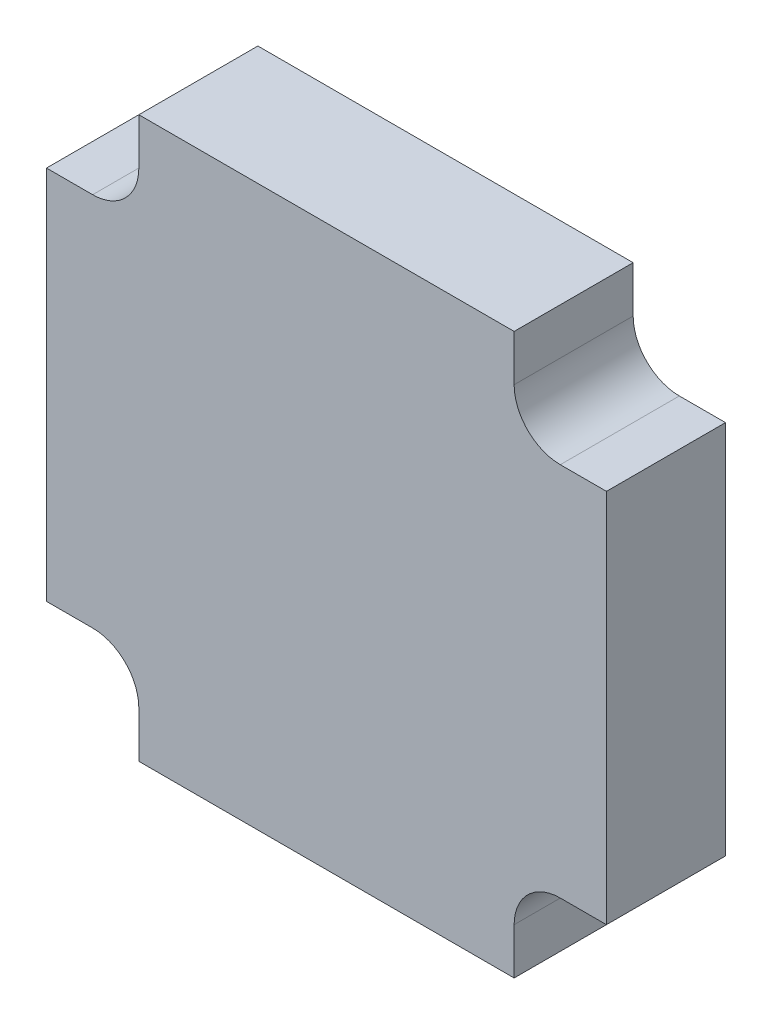
ISO-10303-21;
HEADER;
FILE_DESCRIPTION(('STEP AP214'),'2;1');
FILE_NAME('part.step','',(''),(''),'','','');
FILE_SCHEMA(('AUTOMOTIVE_DESIGN { 1 0 10303 214 1 1 1 1 }'));
ENDSEC;
DATA;
#1=APPLICATION_CONTEXT('core data for automotive mechanical design processes');
#2=APPLICATION_PROTOCOL_DEFINITION('international standard','automotive_design',2000,#1);
#3=PRODUCT_CONTEXT('',#1,'mechanical');
#4=PRODUCT('Part','Part','',(#3));
#5=PRODUCT_RELATED_PRODUCT_CATEGORY('part','',(#4));
#6=PRODUCT_DEFINITION_FORMATION('','',#4);
#7=PRODUCT_DEFINITION_CONTEXT('part definition',#1,'design');
#8=PRODUCT_DEFINITION('design','',#6,#7);
#9=PRODUCT_DEFINITION_SHAPE('','',#8);
#10=(LENGTH_UNIT() NAMED_UNIT(*) SI_UNIT(.MILLI.,.METRE.));
#11=(NAMED_UNIT(*) PLANE_ANGLE_UNIT() SI_UNIT($,.RADIAN.));
#12=(NAMED_UNIT(*) SI_UNIT($,.STERADIAN.) SOLID_ANGLE_UNIT());
#13=UNCERTAINTY_MEASURE_WITH_UNIT(LENGTH_MEASURE(1.E-05),#10,'distance_accuracy_value','');
#14=(GEOMETRIC_REPRESENTATION_CONTEXT(3) GLOBAL_UNCERTAINTY_ASSIGNED_CONTEXT((#13)) GLOBAL_UNIT_ASSIGNED_CONTEXT((#10,
#11,#12)) REPRESENTATION_CONTEXT('',''));
#15=CARTESIAN_POINT('',(0.,0.,0.));
#16=DIRECTION('',(0.,0.,1.));
#17=DIRECTION('',(1.,0.,0.));
#18=AXIS2_PLACEMENT_3D('',#15,#16,#17);
#19=CARTESIAN_POINT('',(0.,0.,-51.));
#20=DIRECTION('',(0.,0.,-1.));
#21=DIRECTION('',(-1.,0.,0.));
#22=AXIS2_PLACEMENT_3D('',#19,#20,#21);
#23=PLANE('',#22);
#24=CARTESIAN_POINT('',(0.,0.,-51.));
#25=DIRECTION('',(0.,0.,-1.));
#26=DIRECTION('',(-1.,0.,0.));
#27=AXIS2_PLACEMENT_3D('',#24,#25,#26);
#28=CIRCLE('',#27,6.);
#29=CARTESIAN_POINT('',(-6.,0.,-51.));
#30=VERTEX_POINT('',#29);
#31=EDGE_CURVE('E20',#30,#30,#28,.T.);
#32=ORIENTED_EDGE('',*,*,#31,.T.);
#33=EDGE_LOOP('',(#32));
#34=FACE_BOUND('',#33,.T.);
#35=ADVANCED_FACE('F17',(#34),#23,.T.);
#36=CARTESIAN_POINT('',(0.,0.,-51.));
#37=DIRECTION('',(0.,0.,-1.));
#38=DIRECTION('',(-1.,0.,0.));
#39=AXIS2_PLACEMENT_3D('',#36,#37,#38);
#40=CYLINDRICAL_SURFACE('',#39,6.);
#41=CARTESIAN_POINT('',(0.,0.,-54.));
#42=DIRECTION('',(0.,0.,-1.));
#43=DIRECTION('',(-1.,0.,0.));
#44=AXIS2_PLACEMENT_3D('',#41,#42,#43);
#45=CIRCLE('',#44,6.);
#46=CARTESIAN_POINT('',(-6.,0.,-54.));
#47=VERTEX_POINT('',#46);
#48=EDGE_CURVE('E230',#47,#47,#45,.F.);
#49=ORIENTED_EDGE('',*,*,#48,.F.);
#50=EDGE_LOOP('',(#49));
#51=FACE_BOUND('',#50,.T.);
#52=ORIENTED_EDGE('',*,*,#31,.F.);
#53=EDGE_LOOP('',(#52));
#54=FACE_BOUND('',#53,.T.);
#55=ADVANCED_FACE('F219',(#51,#54),#40,.F.);
#56=CARTESIAN_POINT('',(28.2,28.2,-54.));
#57=DIRECTION('',(0.,0.,-1.));
#58=DIRECTION('',(-1.,0.,0.));
#59=AXIS2_PLACEMENT_3D('',#56,#57,#58);
#60=PLANE('',#59);
#61=ORIENTED_EDGE('',*,*,#48,.T.);
#62=EDGE_LOOP('',(#61));
#63=FACE_BOUND('',#62,.T.);
#64=CARTESIAN_POINT('',(-23.55,-23.55,-54.));
#65=DIRECTION('',(0.,0.,-1.));
#66=DIRECTION('',(-1.,0.,0.));
#67=AXIS2_PLACEMENT_3D('',#64,#65,#66);
#68=CIRCLE('',#67,4.65);
#69=CARTESIAN_POINT('',(-18.9,-23.55,-54.));
#70=VERTEX_POINT('',#69);
#71=CARTESIAN_POINT('',(-23.55,-18.9,-54.));
#72=VERTEX_POINT('',#71);
#73=EDGE_CURVE('E248',#70,#72,#68,.F.);
#74=ORIENTED_EDGE('',*,*,#73,.T.);
#75=DIRECTION('',(1.,0.,0.));
#76=VECTOR('',#75,1.);
#77=CARTESIAN_POINT('',(-23.55,-18.9,-54.));
#78=LINE('',#77,#76);
#79=CARTESIAN_POINT('',(-28.2,-18.9,-54.));
#80=VERTEX_POINT('',#79);
#81=EDGE_CURVE('E148',#72,#80,#78,.F.);
#82=ORIENTED_EDGE('',*,*,#81,.T.);
#83=DIRECTION('',(0.,1.,0.));
#84=VECTOR('',#83,1.);
#85=CARTESIAN_POINT('',(-28.2,-28.2,-54.));
#86=LINE('',#85,#84);
#87=CARTESIAN_POINT('',(-28.2,18.9,-54.));
#88=VERTEX_POINT('',#87);
#89=EDGE_CURVE('E100',#88,#80,#86,.F.);
#90=ORIENTED_EDGE('',*,*,#89,.F.);
#91=DIRECTION('',(1.,0.,0.));
#92=VECTOR('',#91,1.);
#93=CARTESIAN_POINT('',(-23.55,18.9,-54.));
#94=LINE('',#93,#92);
#95=CARTESIAN_POINT('',(-23.55,18.9,-54.));
#96=VERTEX_POINT('',#95);
#97=EDGE_CURVE('E95',#88,#96,#94,.T.);
#98=ORIENTED_EDGE('',*,*,#97,.T.);
#99=CARTESIAN_POINT('',(-23.55,23.55,-54.));
#100=DIRECTION('',(0.,0.,-1.));
#101=DIRECTION('',(-1.,0.,0.));
#102=AXIS2_PLACEMENT_3D('',#99,#100,#101);
#103=CIRCLE('',#102,4.65);
#104=CARTESIAN_POINT('',(-18.9,23.55,-54.));
#105=VERTEX_POINT('',#104);
#106=EDGE_CURVE('E236',#96,#105,#103,.F.);
#107=ORIENTED_EDGE('',*,*,#106,.T.);
#108=DIRECTION('',(0.,1.,0.));
#109=VECTOR('',#108,1.);
#110=CARTESIAN_POINT('',(-18.9,23.55,-54.));
#111=LINE('',#110,#109);
#112=CARTESIAN_POINT('',(-18.9,28.2,-54.));
#113=VERTEX_POINT('',#112);
#114=EDGE_CURVE('E272',#105,#113,#111,.T.);
#115=ORIENTED_EDGE('',*,*,#114,.T.);
#116=DIRECTION('',(1.,0.,0.));
#117=VECTOR('',#116,1.);
#118=CARTESIAN_POINT('',(-28.2,28.2,-54.));
#119=LINE('',#118,#117);
#120=CARTESIAN_POINT('',(18.9,28.2,-54.));
#121=VERTEX_POINT('',#120);
#122=EDGE_CURVE('E275',#121,#113,#119,.F.);
#123=ORIENTED_EDGE('',*,*,#122,.F.);
#124=DIRECTION('',(0.,1.,0.));
#125=VECTOR('',#124,1.);
#126=CARTESIAN_POINT('',(18.9,23.55,-54.));
#127=LINE('',#126,#125);
#128=CARTESIAN_POINT('',(18.9,23.55,-54.));
#129=VERTEX_POINT('',#128);
#130=EDGE_CURVE('E282',#121,#129,#127,.F.);
#131=ORIENTED_EDGE('',*,*,#130,.T.);
#132=CARTESIAN_POINT('',(23.55,23.55,-54.));
#133=DIRECTION('',(0.,0.,-1.));
#134=DIRECTION('',(-1.,0.,0.));
#135=AXIS2_PLACEMENT_3D('',#132,#133,#134);
#136=CIRCLE('',#135,4.65);
#137=CARTESIAN_POINT('',(23.55,18.9,-54.));
#138=VERTEX_POINT('',#137);
#139=EDGE_CURVE('E240',#129,#138,#136,.F.);
#140=ORIENTED_EDGE('',*,*,#139,.T.);
#141=DIRECTION('',(1.,0.,0.));
#142=VECTOR('',#141,1.);
#143=CARTESIAN_POINT('',(23.55,18.9,-54.));
#144=LINE('',#143,#142);
#145=CARTESIAN_POINT('',(28.2,18.9,-54.));
#146=VERTEX_POINT('',#145);
#147=EDGE_CURVE('E287',#138,#146,#144,.T.);
#148=ORIENTED_EDGE('',*,*,#147,.T.);
#149=DIRECTION('',(0.,1.,0.));
#150=VECTOR('',#149,1.);
#151=CARTESIAN_POINT('',(28.2,-28.2,-54.));
#152=LINE('',#151,#150);
#153=CARTESIAN_POINT('',(28.2,-18.9,-54.));
#154=VERTEX_POINT('',#153);
#155=EDGE_CURVE('E290',#154,#146,#152,.T.);
#156=ORIENTED_EDGE('',*,*,#155,.F.);
#157=DIRECTION('',(1.,0.,0.));
#158=VECTOR('',#157,1.);
#159=CARTESIAN_POINT('',(23.55,-18.9,-54.));
#160=LINE('',#159,#158);
#161=CARTESIAN_POINT('',(23.55,-18.9,-54.));
#162=VERTEX_POINT('',#161);
#163=EDGE_CURVE('E297',#154,#162,#160,.F.);
#164=ORIENTED_EDGE('',*,*,#163,.T.);
#165=CARTESIAN_POINT('',(23.55,-23.55,-54.));
#166=DIRECTION('',(0.,0.,-1.));
#167=DIRECTION('',(-1.,0.,0.));
#168=AXIS2_PLACEMENT_3D('',#165,#166,#167);
#169=CIRCLE('',#168,4.65);
#170=CARTESIAN_POINT('',(18.9,-23.55,-54.));
#171=VERTEX_POINT('',#170);
#172=EDGE_CURVE('E244',#162,#171,#169,.F.);
#173=ORIENTED_EDGE('',*,*,#172,.T.);
#174=DIRECTION('',(0.,1.,0.));
#175=VECTOR('',#174,1.);
#176=CARTESIAN_POINT('',(18.9,-23.55,-54.));
#177=LINE('',#176,#175);
#178=CARTESIAN_POINT('',(18.9,-28.2,-54.));
#179=VERTEX_POINT('',#178);
#180=EDGE_CURVE('E302',#171,#179,#177,.F.);
#181=ORIENTED_EDGE('',*,*,#180,.T.);
#182=DIRECTION('',(1.,0.,0.));
#183=VECTOR('',#182,1.);
#184=CARTESIAN_POINT('',(-28.2,-28.2,-54.));
#185=LINE('',#184,#183);
#186=CARTESIAN_POINT('',(-18.9,-28.2,-54.));
#187=VERTEX_POINT('',#186);
#188=EDGE_CURVE('E305',#187,#179,#185,.T.);
#189=ORIENTED_EDGE('',*,*,#188,.F.);
#190=DIRECTION('',(0.,1.,0.));
#191=VECTOR('',#190,1.);
#192=CARTESIAN_POINT('',(-18.9,-23.55,-54.));
#193=LINE('',#192,#191);
#194=EDGE_CURVE('E312',#187,#70,#193,.T.);
#195=ORIENTED_EDGE('',*,*,#194,.T.);
#196=EDGE_LOOP('',(#74,#82,#90,#98,#107,#115,#123,#131,#140,#148,#156,#164,#173,#181,#189,#195));
#197=FACE_BOUND('',#196,.T.);
#198=ADVANCED_FACE('F217',(#63,#197),#60,.T.);
#199=CARTESIAN_POINT('',(-28.2,-28.2,-54.));
#200=DIRECTION('',(-1.,0.,0.));
#201=DIRECTION('',(0.,0.,1.));
#202=AXIS2_PLACEMENT_3D('',#199,#200,#201);
#203=PLANE('',#202);
#204=DIRECTION('',(0.,0.,1.));
#205=VECTOR('',#204,1.);
#206=CARTESIAN_POINT('',(-28.2,-18.9,-4.8));
#207=LINE('',#206,#205);
#208=CARTESIAN_POINT('',(-28.2,-18.9,-42.01));
#209=VERTEX_POINT('',#208);
#210=EDGE_CURVE('E144',#80,#209,#207,.T.);
#211=ORIENTED_EDGE('',*,*,#210,.T.);
#212=DIRECTION('',(0.,1.,0.));
#213=VECTOR('',#212,1.);
#214=CARTESIAN_POINT('',(-28.2,-28.21,-42.01));
#215=LINE('',#214,#213);
#216=CARTESIAN_POINT('',(-28.2,18.9,-42.01));
#217=VERTEX_POINT('',#216);
#218=EDGE_CURVE('E134',#209,#217,#215,.T.);
#219=ORIENTED_EDGE('',*,*,#218,.T.);
#220=DIRECTION('',(0.,0.,-1.));
#221=VECTOR('',#220,1.);
#222=CARTESIAN_POINT('',(-28.2,18.9,-4.8));
#223=LINE('',#222,#221);
#224=EDGE_CURVE('E233',#217,#88,#223,.T.);
#225=ORIENTED_EDGE('',*,*,#224,.T.);
#226=ORIENTED_EDGE('',*,*,#89,.T.);
#227=EDGE_LOOP('',(#211,#219,#225,#226));
#228=FACE_BOUND('',#227,.T.);
#229=ADVANCED_FACE('F147',(#228),#203,.T.);
#230=CARTESIAN_POINT('',(-23.55,18.9,-4.8));
#231=DIRECTION('',(0.,-1.,0.));
#232=DIRECTION('',(0.,0.,-1.));
#233=AXIS2_PLACEMENT_3D('',#230,#231,#232);
#234=PLANE('',#233);
#235=DIRECTION('',(0.,0.,-1.));
#236=VECTOR('',#235,1.);
#237=CARTESIAN_POINT('',(-23.55,18.9,-4.8));
#238=LINE('',#237,#236);
#239=CARTESIAN_POINT('',(-23.55,18.9,-42.01));
#240=VERTEX_POINT('',#239);
#241=EDGE_CURVE('E239',#240,#96,#238,.T.);
#242=ORIENTED_EDGE('',*,*,#241,.T.);
#243=ORIENTED_EDGE('',*,*,#97,.F.);
#244=ORIENTED_EDGE('',*,*,#224,.F.);
#245=DIRECTION('',(-1.,0.,0.));
#246=VECTOR('',#245,1.);
#247=CARTESIAN_POINT('',(28.2,18.9,-42.01));
#248=LINE('',#247,#246);
#249=EDGE_CURVE('E141',#217,#240,#248,.F.);
#250=ORIENTED_EDGE('',*,*,#249,.T.);
#251=EDGE_LOOP('',(#242,#243,#244,#250));
#252=FACE_BOUND('',#251,.T.);
#253=ADVANCED_FACE('F210',(#252),#234,.F.);
#254=CARTESIAN_POINT('',(-23.55,23.55,-4.8));
#255=DIRECTION('',(0.,0.,-1.));
#256=DIRECTION('',(-1.,0.,0.));
#257=AXIS2_PLACEMENT_3D('',#254,#255,#256);
#258=CYLINDRICAL_SURFACE('',#257,4.65);
#259=DIRECTION('',(0.,0.,-1.));
#260=VECTOR('',#259,1.);
#261=CARTESIAN_POINT('',(-18.9,23.55,-4.8));
#262=LINE('',#261,#260);
#263=CARTESIAN_POINT('',(-18.9,23.55,-42.01));
#264=VERTEX_POINT('',#263);
#265=EDGE_CURVE('E238',#264,#105,#262,.T.);
#266=ORIENTED_EDGE('',*,*,#265,.T.);
#267=ORIENTED_EDGE('',*,*,#106,.F.);
#268=ORIENTED_EDGE('',*,*,#241,.F.);
#269=CARTESIAN_POINT('',(-23.55,23.55,-42.01));
#270=DIRECTION('',(0.,0.,-1.));
#271=DIRECTION('',(-1.,0.,0.));
#272=AXIS2_PLACEMENT_3D('',#269,#270,#271);
#273=CIRCLE('',#272,4.65);
#274=EDGE_CURVE('E251',#240,#264,#273,.F.);
#275=ORIENTED_EDGE('',*,*,#274,.T.);
#276=EDGE_LOOP('',(#266,#267,#268,#275));
#277=FACE_BOUND('',#276,.T.);
#278=ADVANCED_FACE('F206',(#277),#258,.F.);
#279=CARTESIAN_POINT('',(-18.9,23.55,-4.8));
#280=DIRECTION('',(1.,0.,0.));
#281=DIRECTION('',(0.,0.,-1.));
#282=AXIS2_PLACEMENT_3D('',#279,#280,#281);
#283=PLANE('',#282);
#284=DIRECTION('',(0.,0.,1.));
#285=VECTOR('',#284,1.);
#286=CARTESIAN_POINT('',(-18.9,28.2,-54.));
#287=LINE('',#286,#285);
#288=CARTESIAN_POINT('',(-18.9,28.2,-42.01));
#289=VERTEX_POINT('',#288);
#290=EDGE_CURVE('E279',#113,#289,#287,.T.);
#291=ORIENTED_EDGE('',*,*,#290,.F.);
#292=ORIENTED_EDGE('',*,*,#114,.F.);
#293=ORIENTED_EDGE('',*,*,#265,.F.);
#294=DIRECTION('',(0.,1.,0.));
#295=VECTOR('',#294,1.);
#296=CARTESIAN_POINT('',(-18.9,-28.21,-42.01));
#297=LINE('',#296,#295);
#298=EDGE_CURVE('E254',#264,#289,#297,.T.);
#299=ORIENTED_EDGE('',*,*,#298,.T.);
#300=EDGE_LOOP('',(#291,#292,#293,#299));
#301=FACE_BOUND('',#300,.T.);
#302=ADVANCED_FACE('F202',(#301),#283,.F.);
#303=CARTESIAN_POINT('',(-28.2,28.2,-54.));
#304=DIRECTION('',(0.,1.,0.));
#305=DIRECTION('',(0.,0.,1.));
#306=AXIS2_PLACEMENT_3D('',#303,#304,#305);
#307=PLANE('',#306);
#308=ORIENTED_EDGE('',*,*,#290,.T.);
#309=DIRECTION('',(-1.,0.,0.));
#310=VECTOR('',#309,1.);
#311=CARTESIAN_POINT('',(28.2,28.2,-42.01));
#312=LINE('',#311,#310);
#313=CARTESIAN_POINT('',(18.9,28.2,-42.01));
#314=VERTEX_POINT('',#313);
#315=EDGE_CURVE('E332',#289,#314,#312,.F.);
#316=ORIENTED_EDGE('',*,*,#315,.T.);
#317=DIRECTION('',(0.,0.,1.));
#318=VECTOR('',#317,1.);
#319=CARTESIAN_POINT('',(18.9,28.2,-4.8));
#320=LINE('',#319,#318);
#321=EDGE_CURVE('E284',#314,#121,#320,.F.);
#322=ORIENTED_EDGE('',*,*,#321,.T.);
#323=ORIENTED_EDGE('',*,*,#122,.T.);
#324=EDGE_LOOP('',(#308,#316,#322,#323));
#325=FACE_BOUND('',#324,.T.);
#326=ADVANCED_FACE('F198',(#325),#307,.T.);
#327=CARTESIAN_POINT('',(18.9,23.55,-4.8));
#328=DIRECTION('',(-1.,0.,0.));
#329=DIRECTION('',(0.,0.,1.));
#330=AXIS2_PLACEMENT_3D('',#327,#328,#329);
#331=PLANE('',#330);
#332=DIRECTION('',(0.,0.,-1.));
#333=VECTOR('',#332,1.);
#334=CARTESIAN_POINT('',(18.9,23.55,-4.8));
#335=LINE('',#334,#333);
#336=CARTESIAN_POINT('',(18.9,23.55,-42.01));
#337=VERTEX_POINT('',#336);
#338=EDGE_CURVE('E243',#337,#129,#335,.T.);
#339=ORIENTED_EDGE('',*,*,#338,.T.);
#340=ORIENTED_EDGE('',*,*,#130,.F.);
#341=ORIENTED_EDGE('',*,*,#321,.F.);
#342=DIRECTION('',(0.,1.,0.));
#343=VECTOR('',#342,1.);
#344=CARTESIAN_POINT('',(18.9,-28.21,-42.01));
#345=LINE('',#344,#343);
#346=EDGE_CURVE('E259',#314,#337,#345,.F.);
#347=ORIENTED_EDGE('',*,*,#346,.T.);
#348=EDGE_LOOP('',(#339,#340,#341,#347));
#349=FACE_BOUND('',#348,.T.);
#350=ADVANCED_FACE('F194',(#349),#331,.F.);
#351=CARTESIAN_POINT('',(23.55,23.55,-4.8));
#352=DIRECTION('',(0.,0.,-1.));
#353=DIRECTION('',(-1.,0.,0.));
#354=AXIS2_PLACEMENT_3D('',#351,#352,#353);
#355=CYLINDRICAL_SURFACE('',#354,4.65);
#356=DIRECTION('',(0.,0.,-1.));
#357=VECTOR('',#356,1.);
#358=CARTESIAN_POINT('',(23.55,18.9,-4.8));
#359=LINE('',#358,#357);
#360=CARTESIAN_POINT('',(23.55,18.9,-42.01));
#361=VERTEX_POINT('',#360);
#362=EDGE_CURVE('E242',#361,#138,#359,.T.);
#363=ORIENTED_EDGE('',*,*,#362,.T.);
#364=ORIENTED_EDGE('',*,*,#139,.F.);
#365=ORIENTED_EDGE('',*,*,#338,.F.);
#366=CARTESIAN_POINT('',(23.55,23.55,-42.01));
#367=DIRECTION('',(0.,0.,-1.));
#368=DIRECTION('',(-1.,0.,0.));
#369=AXIS2_PLACEMENT_3D('',#366,#367,#368);
#370=CIRCLE('',#369,4.65);
#371=EDGE_CURVE('E255',#337,#361,#370,.F.);
#372=ORIENTED_EDGE('',*,*,#371,.T.);
#373=EDGE_LOOP('',(#363,#364,#365,#372));
#374=FACE_BOUND('',#373,.T.);
#375=ADVANCED_FACE('F190',(#374),#355,.F.);
#376=CARTESIAN_POINT('',(23.55,18.9,-4.8));
#377=DIRECTION('',(0.,-1.,0.));
#378=DIRECTION('',(0.,0.,-1.));
#379=AXIS2_PLACEMENT_3D('',#376,#377,#378);
#380=PLANE('',#379);
#381=DIRECTION('',(0.,0.,-1.));
#382=VECTOR('',#381,1.);
#383=CARTESIAN_POINT('',(28.2,18.9,-54.));
#384=LINE('',#383,#382);
#385=CARTESIAN_POINT('',(28.2,18.9,-42.01));
#386=VERTEX_POINT('',#385);
#387=EDGE_CURVE('E294',#146,#386,#384,.F.);
#388=ORIENTED_EDGE('',*,*,#387,.F.);
#389=ORIENTED_EDGE('',*,*,#147,.F.);
#390=ORIENTED_EDGE('',*,*,#362,.F.);
#391=DIRECTION('',(-1.,0.,0.));
#392=VECTOR('',#391,1.);
#393=CARTESIAN_POINT('',(28.2,18.9,-42.01));
#394=LINE('',#393,#392);
#395=EDGE_CURVE('E258',#361,#386,#394,.F.);
#396=ORIENTED_EDGE('',*,*,#395,.T.);
#397=EDGE_LOOP('',(#388,#389,#390,#396));
#398=FACE_BOUND('',#397,.T.);
#399=ADVANCED_FACE('F186',(#398),#380,.F.);
#400=CARTESIAN_POINT('',(28.2,-28.2,-54.));
#401=DIRECTION('',(1.,0.,0.));
#402=DIRECTION('',(0.,0.,-1.));
#403=AXIS2_PLACEMENT_3D('',#400,#401,#402);
#404=PLANE('',#403);
#405=ORIENTED_EDGE('',*,*,#387,.T.);
#406=DIRECTION('',(0.,1.,0.));
#407=VECTOR('',#406,1.);
#408=CARTESIAN_POINT('',(28.2,-28.21,-42.01));
#409=LINE('',#408,#407);
#410=CARTESIAN_POINT('',(28.2,-18.9,-42.01));
#411=VERTEX_POINT('',#410);
#412=EDGE_CURVE('E348',#386,#411,#409,.F.);
#413=ORIENTED_EDGE('',*,*,#412,.T.);
#414=DIRECTION('',(0.,0.,1.));
#415=VECTOR('',#414,1.);
#416=CARTESIAN_POINT('',(28.2,-18.9,-4.8));
#417=LINE('',#416,#415);
#418=EDGE_CURVE('E299',#411,#154,#417,.F.);
#419=ORIENTED_EDGE('',*,*,#418,.T.);
#420=ORIENTED_EDGE('',*,*,#155,.T.);
#421=EDGE_LOOP('',(#405,#413,#419,#420));
#422=FACE_BOUND('',#421,.T.);
#423=ADVANCED_FACE('F182',(#422),#404,.T.);
#424=CARTESIAN_POINT('',(23.55,-18.9,-4.8));
#425=DIRECTION('',(0.,1.,0.));
#426=DIRECTION('',(0.,0.,1.));
#427=AXIS2_PLACEMENT_3D('',#424,#425,#426);
#428=PLANE('',#427);
#429=DIRECTION('',(0.,0.,-1.));
#430=VECTOR('',#429,1.);
#431=CARTESIAN_POINT('',(23.55,-18.9,-4.8));
#432=LINE('',#431,#430);
#433=CARTESIAN_POINT('',(23.55,-18.9,-42.01));
#434=VERTEX_POINT('',#433);
#435=EDGE_CURVE('E247',#434,#162,#432,.T.);
#436=ORIENTED_EDGE('',*,*,#435,.T.);
#437=ORIENTED_EDGE('',*,*,#163,.F.);
#438=ORIENTED_EDGE('',*,*,#418,.F.);
#439=DIRECTION('',(-1.,0.,0.));
#440=VECTOR('',#439,1.);
#441=CARTESIAN_POINT('',(28.2,-18.9,-42.01));
#442=LINE('',#441,#440);
#443=EDGE_CURVE('E264',#411,#434,#442,.T.);
#444=ORIENTED_EDGE('',*,*,#443,.T.);
#445=EDGE_LOOP('',(#436,#437,#438,#444));
#446=FACE_BOUND('',#445,.T.);
#447=ADVANCED_FACE('F178',(#446),#428,.F.);
#448=CARTESIAN_POINT('',(23.55,-23.55,-4.8));
#449=DIRECTION('',(0.,0.,-1.));
#450=DIRECTION('',(-1.,0.,0.));
#451=AXIS2_PLACEMENT_3D('',#448,#449,#450);
#452=CYLINDRICAL_SURFACE('',#451,4.65);
#453=DIRECTION('',(0.,0.,1.));
#454=VECTOR('',#453,1.);
#455=CARTESIAN_POINT('',(18.9,-23.55,-4.8));
#456=LINE('',#455,#454);
#457=CARTESIAN_POINT('',(18.9,-23.55,-42.01));
#458=VERTEX_POINT('',#457);
#459=EDGE_CURVE('E246',#458,#171,#456,.F.);
#460=ORIENTED_EDGE('',*,*,#459,.T.);
#461=ORIENTED_EDGE('',*,*,#172,.F.);
#462=ORIENTED_EDGE('',*,*,#435,.F.);
#463=CARTESIAN_POINT('',(23.55,-23.55,-42.01));
#464=DIRECTION('',(0.,0.,-1.));
#465=DIRECTION('',(-1.,0.,0.));
#466=AXIS2_PLACEMENT_3D('',#463,#464,#465);
#467=CIRCLE('',#466,4.65);
#468=EDGE_CURVE('E260',#434,#458,#467,.F.);
#469=ORIENTED_EDGE('',*,*,#468,.T.);
#470=EDGE_LOOP('',(#460,#461,#462,#469));
#471=FACE_BOUND('',#470,.T.);
#472=ADVANCED_FACE('F174',(#471),#452,.F.);
#473=CARTESIAN_POINT('',(18.9,-23.55,-4.8));
#474=DIRECTION('',(-1.,0.,0.));
#475=DIRECTION('',(0.,0.,1.));
#476=AXIS2_PLACEMENT_3D('',#473,#474,#475);
#477=PLANE('',#476);
#478=DIRECTION('',(0.,0.,-1.));
#479=VECTOR('',#478,1.);
#480=CARTESIAN_POINT('',(18.9,-28.2,-54.));
#481=LINE('',#480,#479);
#482=CARTESIAN_POINT('',(18.9,-28.2,-42.01));
#483=VERTEX_POINT('',#482);
#484=EDGE_CURVE('E309',#179,#483,#481,.F.);
#485=ORIENTED_EDGE('',*,*,#484,.F.);
#486=ORIENTED_EDGE('',*,*,#180,.F.);
#487=ORIENTED_EDGE('',*,*,#459,.F.);
#488=DIRECTION('',(0.,1.,0.));
#489=VECTOR('',#488,1.);
#490=CARTESIAN_POINT('',(18.9,-28.21,-42.01));
#491=LINE('',#490,#489);
#492=EDGE_CURVE('E263',#458,#483,#491,.F.);
#493=ORIENTED_EDGE('',*,*,#492,.T.);
#494=EDGE_LOOP('',(#485,#486,#487,#493));
#495=FACE_BOUND('',#494,.T.);
#496=ADVANCED_FACE('F170',(#495),#477,.F.);
#497=CARTESIAN_POINT('',(-28.2,-28.2,-54.));
#498=DIRECTION('',(0.,-1.,0.));
#499=DIRECTION('',(0.,0.,-1.));
#500=AXIS2_PLACEMENT_3D('',#497,#498,#499);
#501=PLANE('',#500);
#502=ORIENTED_EDGE('',*,*,#484,.T.);
#503=DIRECTION('',(-1.,0.,0.));
#504=VECTOR('',#503,1.);
#505=CARTESIAN_POINT('',(28.2,-28.2,-42.01));
#506=LINE('',#505,#504);
#507=CARTESIAN_POINT('',(-18.9,-28.2,-42.01));
#508=VERTEX_POINT('',#507);
#509=EDGE_CURVE('E364',#483,#508,#506,.T.);
#510=ORIENTED_EDGE('',*,*,#509,.T.);
#511=DIRECTION('',(0.,0.,-1.));
#512=VECTOR('',#511,1.);
#513=CARTESIAN_POINT('',(-18.9,-28.2,-4.8));
#514=LINE('',#513,#512);
#515=EDGE_CURVE('E314',#508,#187,#514,.T.);
#516=ORIENTED_EDGE('',*,*,#515,.T.);
#517=ORIENTED_EDGE('',*,*,#188,.T.);
#518=EDGE_LOOP('',(#502,#510,#516,#517));
#519=FACE_BOUND('',#518,.T.);
#520=ADVANCED_FACE('F166',(#519),#501,.T.);
#521=CARTESIAN_POINT('',(-18.9,-23.55,-4.8));
#522=DIRECTION('',(1.,0.,0.));
#523=DIRECTION('',(0.,0.,-1.));
#524=AXIS2_PLACEMENT_3D('',#521,#522,#523);
#525=PLANE('',#524);
#526=DIRECTION('',(0.,0.,-1.));
#527=VECTOR('',#526,1.);
#528=CARTESIAN_POINT('',(-18.9,-23.55,-4.8));
#529=LINE('',#528,#527);
#530=CARTESIAN_POINT('',(-18.9,-23.55,-42.01));
#531=VERTEX_POINT('',#530);
#532=EDGE_CURVE('E250',#531,#70,#529,.T.);
#533=ORIENTED_EDGE('',*,*,#532,.T.);
#534=ORIENTED_EDGE('',*,*,#194,.F.);
#535=ORIENTED_EDGE('',*,*,#515,.F.);
#536=DIRECTION('',(0.,1.,0.));
#537=VECTOR('',#536,1.);
#538=CARTESIAN_POINT('',(-18.9,-28.21,-42.01));
#539=LINE('',#538,#537);
#540=EDGE_CURVE('E266',#508,#531,#539,.T.);
#541=ORIENTED_EDGE('',*,*,#540,.T.);
#542=EDGE_LOOP('',(#533,#534,#535,#541));
#543=FACE_BOUND('',#542,.T.);
#544=ADVANCED_FACE('F160',(#543),#525,.F.);
#545=CARTESIAN_POINT('',(-23.55,-23.55,-4.8));
#546=DIRECTION('',(0.,0.,-1.));
#547=DIRECTION('',(-1.,0.,0.));
#548=AXIS2_PLACEMENT_3D('',#545,#546,#547);
#549=CYLINDRICAL_SURFACE('',#548,4.65);
#550=DIRECTION('',(0.,0.,1.));
#551=VECTOR('',#550,1.);
#552=CARTESIAN_POINT('',(-23.55,-18.9,-4.8));
#553=LINE('',#552,#551);
#554=CARTESIAN_POINT('',(-23.55,-18.9,-42.01));
#555=VERTEX_POINT('',#554);
#556=EDGE_CURVE('E34',#555,#72,#553,.F.);
#557=ORIENTED_EDGE('',*,*,#556,.T.);
#558=ORIENTED_EDGE('',*,*,#73,.F.);
#559=ORIENTED_EDGE('',*,*,#532,.F.);
#560=CARTESIAN_POINT('',(-23.55,-23.55,-42.01));
#561=DIRECTION('',(0.,0.,-1.));
#562=DIRECTION('',(-1.,0.,0.));
#563=AXIS2_PLACEMENT_3D('',#560,#561,#562);
#564=CIRCLE('',#563,4.65);
#565=EDGE_CURVE('E26',#531,#555,#564,.F.);
#566=ORIENTED_EDGE('',*,*,#565,.T.);
#567=EDGE_LOOP('',(#557,#558,#559,#566));
#568=FACE_BOUND('',#567,.T.);
#569=ADVANCED_FACE('F152',(#568),#549,.F.);
#570=CARTESIAN_POINT('',(-23.55,-18.9,-4.8));
#571=DIRECTION('',(0.,1.,0.));
#572=DIRECTION('',(0.,0.,1.));
#573=AXIS2_PLACEMENT_3D('',#570,#571,#572);
#574=PLANE('',#573);
#575=ORIENTED_EDGE('',*,*,#210,.F.);
#576=ORIENTED_EDGE('',*,*,#81,.F.);
#577=ORIENTED_EDGE('',*,*,#556,.F.);
#578=DIRECTION('',(-1.,0.,0.));
#579=VECTOR('',#578,1.);
#580=CARTESIAN_POINT('',(28.2,-18.9,-42.01));
#581=LINE('',#580,#579);
#582=EDGE_CURVE('E11',#555,#209,#581,.T.);
#583=ORIENTED_EDGE('',*,*,#582,.T.);
#584=EDGE_LOOP('',(#575,#576,#577,#583));
#585=FACE_BOUND('',#584,.T.);
#586=ADVANCED_FACE('F150',(#585),#574,.F.);
#587=CARTESIAN_POINT('',(28.2,-28.21,-42.01));
#588=DIRECTION('',(0.,0.,-1.));
#589=DIRECTION('',(-1.,0.,0.));
#590=AXIS2_PLACEMENT_3D('',#587,#588,#589);
#591=PLANE('',#590);
#592=ORIENTED_EDGE('',*,*,#565,.F.);
#593=ORIENTED_EDGE('',*,*,#540,.F.);
#594=ORIENTED_EDGE('',*,*,#509,.F.);
#595=ORIENTED_EDGE('',*,*,#492,.F.);
#596=ORIENTED_EDGE('',*,*,#468,.F.);
#597=ORIENTED_EDGE('',*,*,#443,.F.);
#598=ORIENTED_EDGE('',*,*,#412,.F.);
#599=ORIENTED_EDGE('',*,*,#395,.F.);
#600=ORIENTED_EDGE('',*,*,#371,.F.);
#601=ORIENTED_EDGE('',*,*,#346,.F.);
#602=ORIENTED_EDGE('',*,*,#315,.F.);
#603=ORIENTED_EDGE('',*,*,#298,.F.);
#604=ORIENTED_EDGE('',*,*,#274,.F.);
#605=ORIENTED_EDGE('',*,*,#249,.F.);
#606=ORIENTED_EDGE('',*,*,#218,.F.);
#607=ORIENTED_EDGE('',*,*,#582,.F.);
#608=EDGE_LOOP('',(#592,#593,#594,#595,#596,#597,#598,#599,#600,#601,#602,#603,#604,#605,#606,#607));
#609=FACE_BOUND('',#608,.T.);
#610=ADVANCED_FACE('F137',(#609),#591,.F.);
#611=CLOSED_SHELL('',(#35,#55,#198,#229,#253,#278,#302,#326,#350,#375,#399,#423,#447,#472,#496,
#520,#544,#569,#586,#610));
#612=MANIFOLD_SOLID_BREP('B1',#611);
#613=ADVANCED_BREP_SHAPE_REPRESENTATION('',(#18,#612),#14);
#614=SHAPE_DEFINITION_REPRESENTATION(#9,#613);
ENDSEC;
END-ISO-10303-21;
